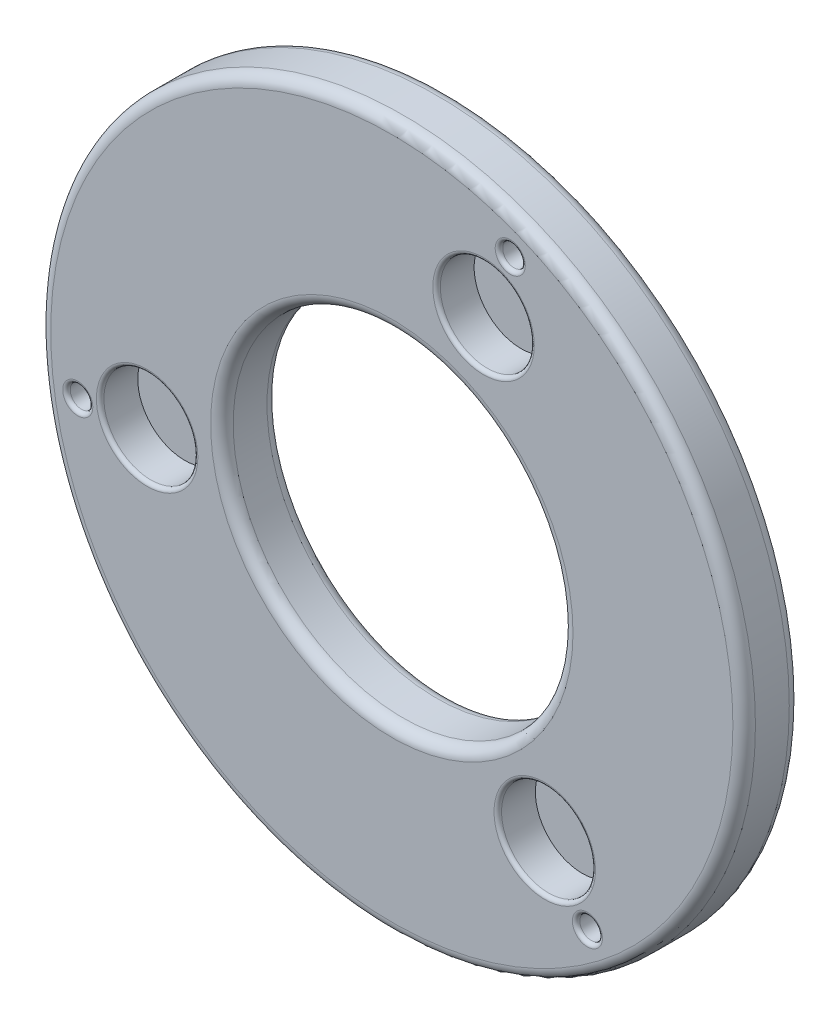
ISO-10303-21;
HEADER;
FILE_DESCRIPTION(('STEP AP214'),'2;1');
FILE_NAME('part.step','',(''),(''),'','','');
FILE_SCHEMA(('AUTOMOTIVE_DESIGN { 1 0 10303 214 1 1 1 1 }'));
ENDSEC;
DATA;
#1=APPLICATION_CONTEXT('core data for automotive mechanical design processes');
#2=APPLICATION_PROTOCOL_DEFINITION('international standard','automotive_design',2000,#1);
#3=PRODUCT_CONTEXT('',#1,'mechanical');
#4=PRODUCT('Part','Part','',(#3));
#5=PRODUCT_RELATED_PRODUCT_CATEGORY('part','',(#4));
#6=PRODUCT_DEFINITION_FORMATION('','',#4);
#7=PRODUCT_DEFINITION_CONTEXT('part definition',#1,'design');
#8=PRODUCT_DEFINITION('design','',#6,#7);
#9=PRODUCT_DEFINITION_SHAPE('','',#8);
#10=(LENGTH_UNIT() NAMED_UNIT(*) SI_UNIT(.MILLI.,.METRE.));
#11=(NAMED_UNIT(*) PLANE_ANGLE_UNIT() SI_UNIT($,.RADIAN.));
#12=(NAMED_UNIT(*) SI_UNIT($,.STERADIAN.) SOLID_ANGLE_UNIT());
#13=UNCERTAINTY_MEASURE_WITH_UNIT(LENGTH_MEASURE(1.E-05),#10,'distance_accuracy_value','');
#14=(GEOMETRIC_REPRESENTATION_CONTEXT(3) GLOBAL_UNCERTAINTY_ASSIGNED_CONTEXT((#13)) GLOBAL_UNIT_ASSIGNED_CONTEXT((#10,
#11,#12)) REPRESENTATION_CONTEXT('',''));
#15=CARTESIAN_POINT('',(0.,0.,0.));
#16=DIRECTION('',(0.,0.,1.));
#17=DIRECTION('',(1.,0.,0.));
#18=AXIS2_PLACEMENT_3D('',#15,#16,#17);
#19=CARTESIAN_POINT('',(0.,0.,30.));
#20=DIRECTION('',(0.,0.,-1.));
#21=DIRECTION('',(-1.,0.,0.));
#22=AXIS2_PLACEMENT_3D('',#19,#20,#21);
#23=CYLINDRICAL_SURFACE('',#22,187.5);
#24=CARTESIAN_POINT('',(0.,0.,6.));
#25=DIRECTION('',(0.,0.,1.));
#26=DIRECTION('',(1.,0.,0.));
#27=AXIS2_PLACEMENT_3D('',#24,#25,#26);
#28=CIRCLE('',#27,187.5);
#29=CARTESIAN_POINT('',(187.5,0.,6.));
#30=VERTEX_POINT('',#29);
#31=EDGE_CURVE('E63',#30,#30,#28,.T.);
#32=ORIENTED_EDGE('',*,*,#31,.T.);
#33=EDGE_LOOP('',(#32));
#34=FACE_BOUND('',#33,.T.);
#35=CARTESIAN_POINT('',(0.,0.,24.));
#36=DIRECTION('',(0.,0.,1.));
#37=DIRECTION('',(1.,0.,0.));
#38=AXIS2_PLACEMENT_3D('',#35,#36,#37);
#39=CIRCLE('',#38,187.5);
#40=CARTESIAN_POINT('',(187.5,0.,24.));
#41=VERTEX_POINT('',#40);
#42=EDGE_CURVE('E66',#41,#41,#39,.F.);
#43=ORIENTED_EDGE('',*,*,#42,.T.);
#44=EDGE_LOOP('',(#43));
#45=FACE_BOUND('',#44,.T.);
#46=ADVANCED_FACE('F37',(#34,#45),#23,.T.);
#47=CARTESIAN_POINT('',(0.,0.,30.));
#48=DIRECTION('',(0.,0.,1.));
#49=DIRECTION('',(1.,0.,0.));
#50=AXIS2_PLACEMENT_3D('',#47,#48,#49);
#51=PLANE('',#50);
#52=CARTESIAN_POINT('',(0.,0.,30.));
#53=DIRECTION('',(0.,0.,1.));
#54=DIRECTION('',(1.,0.,0.));
#55=AXIS2_PLACEMENT_3D('',#52,#53,#54);
#56=CIRCLE('',#55,96.4223656586048);
#57=CARTESIAN_POINT('',(96.4223656586048,0.,30.));
#58=VERTEX_POINT('',#57);
#59=EDGE_CURVE('E11',#58,#58,#56,.F.);
#60=ORIENTED_EDGE('',*,*,#59,.T.);
#61=EDGE_LOOP('',(#60));
#62=FACE_BOUND('',#61,.T.);
#63=CARTESIAN_POINT('',(0.,0.,30.));
#64=DIRECTION('',(0.,0.,1.));
#65=DIRECTION('',(1.,0.,0.));
#66=AXIS2_PLACEMENT_3D('',#63,#64,#65);
#67=CIRCLE('',#66,181.5);
#68=CARTESIAN_POINT('',(181.5,0.,30.));
#69=VERTEX_POINT('',#68);
#70=EDGE_CURVE('E57',#69,#69,#67,.T.);
#71=ORIENTED_EDGE('',*,*,#70,.T.);
#72=EDGE_LOOP('',(#71));
#73=FACE_BOUND('',#72,.T.);
#74=CARTESIAN_POINT('',(63.0228527870285,156.566120575123,30.));
#75=DIRECTION('',(0.,0.,1.));
#76=DIRECTION('',(1.,0.,0.));
#77=AXIS2_PLACEMENT_3D('',#74,#75,#76);
#78=CIRCLE('',#77,8.00000000000002);
#79=CARTESIAN_POINT('',(71.0228527870285,156.566120575123,30.));
#80=VERTEX_POINT('',#79);
#81=EDGE_CURVE('E69',#80,#80,#78,.F.);
#82=ORIENTED_EDGE('',*,*,#81,.T.);
#83=EDGE_LOOP('',(#82));
#84=FACE_BOUND('',#83,.T.);
#85=CARTESIAN_POINT('',(104.078811396519,-132.862451820095,30.));
#86=DIRECTION('',(0.,0.,1.));
#87=DIRECTION('',(1.,0.,0.));
#88=AXIS2_PLACEMENT_3D('',#85,#86,#87);
#89=CIRCLE('',#88,8.00000000000002);
#90=CARTESIAN_POINT('',(112.078811396519,-132.862451820095,30.));
#91=VERTEX_POINT('',#90);
#92=EDGE_CURVE('E72',#91,#91,#89,.F.);
#93=ORIENTED_EDGE('',*,*,#92,.T.);
#94=EDGE_LOOP('',(#93));
#95=FACE_BOUND('',#94,.T.);
#96=CARTESIAN_POINT('',(-167.101664183548,-23.7036687550278,30.));
#97=DIRECTION('',(0.,0.,1.));
#98=DIRECTION('',(1.,0.,0.));
#99=AXIS2_PLACEMENT_3D('',#96,#97,#98);
#100=CIRCLE('',#99,8.00000000000002);
#101=CARTESIAN_POINT('',(-159.101664183548,-23.7036687550278,30.));
#102=VERTEX_POINT('',#101);
#103=EDGE_CURVE('E75',#102,#102,#100,.F.);
#104=ORIENTED_EDGE('',*,*,#103,.T.);
#105=EDGE_LOOP('',(#104));
#106=FACE_BOUND('',#105,.T.);
#107=CARTESIAN_POINT('',(48.8104564622097,122.158080296552,30.));
#108=DIRECTION('',(0.,0.,1.));
#109=DIRECTION('',(1.,0.,0.));
#110=AXIS2_PLACEMENT_3D('',#107,#108,#109);
#111=CIRCLE('',#110,27.);
#112=CARTESIAN_POINT('',(75.8104564622097,122.158080296552,30.));
#113=VERTEX_POINT('',#112);
#114=EDGE_CURVE('E111',#113,#113,#111,.F.);
#115=ORIENTED_EDGE('',*,*,#114,.T.);
#116=EDGE_LOOP('',(#115));
#117=FACE_BOUND('',#116,.T.);
#118=CARTESIAN_POINT('',(81.3867725832482,-103.350135414864,30.));
#119=DIRECTION('',(0.,0.,1.));
#120=DIRECTION('',(1.,0.,0.));
#121=AXIS2_PLACEMENT_3D('',#118,#119,#120);
#122=CIRCLE('',#121,27.);
#123=CARTESIAN_POINT('',(108.386772583248,-103.350135414864,30.));
#124=VERTEX_POINT('',#123);
#125=EDGE_CURVE('E114',#124,#124,#122,.F.);
#126=ORIENTED_EDGE('',*,*,#125,.T.);
#127=EDGE_LOOP('',(#126));
#128=FACE_BOUND('',#127,.T.);
#129=CARTESIAN_POINT('',(-130.197229045458,-18.807944881688,30.));
#130=DIRECTION('',(0.,0.,1.));
#131=DIRECTION('',(1.,0.,0.));
#132=AXIS2_PLACEMENT_3D('',#129,#130,#131);
#133=CIRCLE('',#132,27.);
#134=CARTESIAN_POINT('',(-103.197229045458,-18.807944881688,30.));
#135=VERTEX_POINT('',#134);
#136=EDGE_CURVE('E117',#135,#135,#133,.F.);
#137=ORIENTED_EDGE('',*,*,#136,.T.);
#138=EDGE_LOOP('',(#137));
#139=FACE_BOUND('',#138,.T.);
#140=ADVANCED_FACE('F151',(#62,#73,#84,#95,#106,#117,#128,#139),#51,.T.);
#141=CARTESIAN_POINT('',(0.,0.,0.));
#142=DIRECTION('',(0.,0.,1.));
#143=DIRECTION('',(1.,0.,0.));
#144=AXIS2_PLACEMENT_3D('',#141,#142,#143);
#145=PLANE('',#144);
#146=CARTESIAN_POINT('',(0.,0.,0.));
#147=DIRECTION('',(0.,0.,1.));
#148=DIRECTION('',(1.,0.,0.));
#149=AXIS2_PLACEMENT_3D('',#146,#147,#148);
#150=CIRCLE('',#149,96.4223656586048);
#151=CARTESIAN_POINT('',(96.4223656586048,0.,0.));
#152=VERTEX_POINT('',#151);
#153=EDGE_CURVE('E44',#152,#152,#150,.T.);
#154=ORIENTED_EDGE('',*,*,#153,.T.);
#155=EDGE_LOOP('',(#154));
#156=FACE_BOUND('',#155,.T.);
#157=CARTESIAN_POINT('',(0.,0.,0.));
#158=DIRECTION('',(0.,0.,1.));
#159=DIRECTION('',(1.,0.,0.));
#160=AXIS2_PLACEMENT_3D('',#157,#158,#159);
#161=CIRCLE('',#160,181.5);
#162=CARTESIAN_POINT('',(181.5,0.,0.));
#163=VERTEX_POINT('',#162);
#164=EDGE_CURVE('E60',#163,#163,#161,.F.);
#165=ORIENTED_EDGE('',*,*,#164,.T.);
#166=EDGE_LOOP('',(#165));
#167=FACE_BOUND('',#166,.T.);
#168=CARTESIAN_POINT('',(-167.101664183548,-23.7036687550278,0.));
#169=DIRECTION('',(0.,0.,1.));
#170=DIRECTION('',(1.,0.,0.));
#171=AXIS2_PLACEMENT_3D('',#168,#169,#170);
#172=CIRCLE('',#171,8.00000000000002);
#173=CARTESIAN_POINT('',(-159.101664183548,-23.7036687550278,0.));
#174=VERTEX_POINT('',#173);
#175=EDGE_CURVE('E90',#174,#174,#172,.T.);
#176=ORIENTED_EDGE('',*,*,#175,.T.);
#177=EDGE_LOOP('',(#176));
#178=FACE_BOUND('',#177,.T.);
#179=CARTESIAN_POINT('',(63.0228527870285,156.566120575123,0.));
#180=DIRECTION('',(0.,0.,1.));
#181=DIRECTION('',(1.,0.,0.));
#182=AXIS2_PLACEMENT_3D('',#179,#180,#181);
#183=CIRCLE('',#182,8.00000000000002);
#184=CARTESIAN_POINT('',(71.0228527870285,156.566120575123,0.));
#185=VERTEX_POINT('',#184);
#186=EDGE_CURVE('E93',#185,#185,#183,.T.);
#187=ORIENTED_EDGE('',*,*,#186,.T.);
#188=EDGE_LOOP('',(#187));
#189=FACE_BOUND('',#188,.T.);
#190=CARTESIAN_POINT('',(104.078811396519,-132.862451820095,0.));
#191=DIRECTION('',(0.,0.,1.));
#192=DIRECTION('',(1.,0.,0.));
#193=AXIS2_PLACEMENT_3D('',#190,#191,#192);
#194=CIRCLE('',#193,8.00000000000002);
#195=CARTESIAN_POINT('',(112.078811396519,-132.862451820095,0.));
#196=VERTEX_POINT('',#195);
#197=EDGE_CURVE('E96',#196,#196,#194,.T.);
#198=ORIENTED_EDGE('',*,*,#197,.T.);
#199=EDGE_LOOP('',(#198));
#200=FACE_BOUND('',#199,.T.);
#201=ADVANCED_FACE('F157',(#156,#167,#178,#189,#200),#145,.F.);
#202=CARTESIAN_POINT('',(48.8104564622097,122.158080296552,10.));
#203=DIRECTION('',(0.,0.,1.));
#204=DIRECTION('',(1.,0.,0.));
#205=AXIS2_PLACEMENT_3D('',#202,#203,#204);
#206=CYLINDRICAL_SURFACE('',#205,25.);
#207=CARTESIAN_POINT('',(48.8104564622097,122.158080296552,28.));
#208=DIRECTION('',(0.,0.,1.));
#209=DIRECTION('',(1.,0.,0.));
#210=AXIS2_PLACEMENT_3D('',#207,#208,#209);
#211=CIRCLE('',#210,25.);
#212=CARTESIAN_POINT('',(73.8104564622097,122.158080296552,28.));
#213=VERTEX_POINT('',#212);
#214=EDGE_CURVE('E120',#213,#213,#211,.T.);
#215=ORIENTED_EDGE('',*,*,#214,.T.);
#216=EDGE_LOOP('',(#215));
#217=FACE_BOUND('',#216,.T.);
#218=CARTESIAN_POINT('',(48.8104564622097,122.158080296552,10.));
#219=DIRECTION('',(0.,0.,1.));
#220=DIRECTION('',(1.,0.,0.));
#221=AXIS2_PLACEMENT_3D('',#218,#219,#220);
#222=CIRCLE('',#221,25.);
#223=CARTESIAN_POINT('',(73.8104564622097,122.158080296552,10.));
#224=VERTEX_POINT('',#223);
#225=EDGE_CURVE('E124',#224,#224,#222,.T.);
#226=ORIENTED_EDGE('',*,*,#225,.F.);
#227=EDGE_LOOP('',(#226));
#228=FACE_BOUND('',#227,.T.);
#229=ADVANCED_FACE('F311',(#217,#228),#206,.F.);
#230=CARTESIAN_POINT('',(48.8104564622097,122.158080296552,10.));
#231=DIRECTION('',(0.,0.,1.));
#232=DIRECTION('',(1.,0.,0.));
#233=AXIS2_PLACEMENT_3D('',#230,#231,#232);
#234=PLANE('',#233);
#235=ORIENTED_EDGE('',*,*,#225,.T.);
#236=EDGE_LOOP('',(#235));
#237=FACE_BOUND('',#236,.T.);
#238=ADVANCED_FACE('F333',(#237),#234,.T.);
#239=CARTESIAN_POINT('',(-130.197229045458,-18.807944881688,10.));
#240=DIRECTION('',(0.,0.,1.));
#241=DIRECTION('',(1.,0.,0.));
#242=AXIS2_PLACEMENT_3D('',#239,#240,#241);
#243=CYLINDRICAL_SURFACE('',#242,25.);
#244=CARTESIAN_POINT('',(-130.197229045458,-18.807944881688,28.));
#245=DIRECTION('',(0.,0.,1.));
#246=DIRECTION('',(1.,0.,0.));
#247=AXIS2_PLACEMENT_3D('',#244,#245,#246);
#248=CIRCLE('',#247,25.);
#249=CARTESIAN_POINT('',(-105.197229045458,-18.807944881688,28.));
#250=VERTEX_POINT('',#249);
#251=EDGE_CURVE('E105',#250,#250,#248,.T.);
#252=ORIENTED_EDGE('',*,*,#251,.T.);
#253=EDGE_LOOP('',(#252));
#254=FACE_BOUND('',#253,.T.);
#255=CARTESIAN_POINT('',(-130.197229045458,-18.807944881688,10.));
#256=DIRECTION('',(0.,0.,1.));
#257=DIRECTION('',(1.,0.,0.));
#258=AXIS2_PLACEMENT_3D('',#255,#256,#257);
#259=CIRCLE('',#258,25.);
#260=CARTESIAN_POINT('',(-105.197229045458,-18.807944881688,10.));
#261=VERTEX_POINT('',#260);
#262=EDGE_CURVE('E127',#261,#261,#259,.T.);
#263=ORIENTED_EDGE('',*,*,#262,.F.);
#264=EDGE_LOOP('',(#263));
#265=FACE_BOUND('',#264,.T.);
#266=ADVANCED_FACE('F146',(#254,#265),#243,.F.);
#267=CARTESIAN_POINT('',(-130.197229045458,-18.807944881688,10.));
#268=DIRECTION('',(0.,0.,1.));
#269=DIRECTION('',(1.,0.,0.));
#270=AXIS2_PLACEMENT_3D('',#267,#268,#269);
#271=PLANE('',#270);
#272=ORIENTED_EDGE('',*,*,#262,.T.);
#273=EDGE_LOOP('',(#272));
#274=FACE_BOUND('',#273,.T.);
#275=ADVANCED_FACE('F137',(#274),#271,.T.);
#276=CARTESIAN_POINT('',(81.3867725832482,-103.350135414864,10.));
#277=DIRECTION('',(0.,0.,1.));
#278=DIRECTION('',(1.,0.,0.));
#279=AXIS2_PLACEMENT_3D('',#276,#277,#278);
#280=CYLINDRICAL_SURFACE('',#279,25.);
#281=CARTESIAN_POINT('',(81.3867725832482,-103.350135414864,28.));
#282=DIRECTION('',(0.,0.,1.));
#283=DIRECTION('',(1.,0.,0.));
#284=AXIS2_PLACEMENT_3D('',#281,#282,#283);
#285=CIRCLE('',#284,25.);
#286=CARTESIAN_POINT('',(106.386772583248,-103.350135414864,28.));
#287=VERTEX_POINT('',#286);
#288=EDGE_CURVE('E108',#287,#287,#285,.T.);
#289=ORIENTED_EDGE('',*,*,#288,.T.);
#290=EDGE_LOOP('',(#289));
#291=FACE_BOUND('',#290,.T.);
#292=CARTESIAN_POINT('',(81.3867725832482,-103.350135414864,10.));
#293=DIRECTION('',(0.,0.,1.));
#294=DIRECTION('',(1.,0.,0.));
#295=AXIS2_PLACEMENT_3D('',#292,#293,#294);
#296=CIRCLE('',#295,25.);
#297=CARTESIAN_POINT('',(106.386772583248,-103.350135414864,10.));
#298=VERTEX_POINT('',#297);
#299=EDGE_CURVE('E123',#298,#298,#296,.T.);
#300=ORIENTED_EDGE('',*,*,#299,.F.);
#301=EDGE_LOOP('',(#300));
#302=FACE_BOUND('',#301,.T.);
#303=ADVANCED_FACE('F135',(#291,#302),#280,.F.);
#304=CARTESIAN_POINT('',(81.3867725832482,-103.350135414864,10.));
#305=DIRECTION('',(0.,0.,1.));
#306=DIRECTION('',(1.,0.,0.));
#307=AXIS2_PLACEMENT_3D('',#304,#305,#306);
#308=PLANE('',#307);
#309=ORIENTED_EDGE('',*,*,#299,.T.);
#310=EDGE_LOOP('',(#309));
#311=FACE_BOUND('',#310,.T.);
#312=ADVANCED_FACE('F133',(#311),#308,.T.);
#313=CARTESIAN_POINT('',(63.0228527870285,156.566120575123,-16.9705627484772));
#314=DIRECTION('',(0.,0.,1.));
#315=DIRECTION('',(1.,0.,0.));
#316=AXIS2_PLACEMENT_3D('',#313,#314,#315);
#317=CYLINDRICAL_SURFACE('',#316,6.00000000000002);
#318=CARTESIAN_POINT('',(63.0228527870285,156.566120575123,2.));
#319=DIRECTION('',(0.,0.,1.));
#320=DIRECTION('',(1.,0.,0.));
#321=AXIS2_PLACEMENT_3D('',#318,#319,#320);
#322=CIRCLE('',#321,6.00000000000002);
#323=CARTESIAN_POINT('',(69.0228527870285,156.566120575123,2.));
#324=VERTEX_POINT('',#323);
#325=EDGE_CURVE('E84',#324,#324,#322,.F.);
#326=ORIENTED_EDGE('',*,*,#325,.T.);
#327=EDGE_LOOP('',(#326));
#328=FACE_BOUND('',#327,.T.);
#329=CARTESIAN_POINT('',(63.0228527870285,156.566120575123,28.));
#330=DIRECTION('',(0.,0.,1.));
#331=DIRECTION('',(1.,0.,0.));
#332=AXIS2_PLACEMENT_3D('',#329,#330,#331);
#333=CIRCLE('',#332,6.00000000000002);
#334=CARTESIAN_POINT('',(69.0228527870285,156.566120575123,28.));
#335=VERTEX_POINT('',#334);
#336=EDGE_CURVE('E87',#335,#335,#333,.T.);
#337=ORIENTED_EDGE('',*,*,#336,.T.);
#338=EDGE_LOOP('',(#337));
#339=FACE_BOUND('',#338,.T.);
#340=ADVANCED_FACE('F144',(#328,#339),#317,.F.);
#341=CARTESIAN_POINT('',(-167.101664183548,-23.7036687550278,-16.9705627484772));
#342=DIRECTION('',(0.,0.,1.));
#343=DIRECTION('',(1.,0.,0.));
#344=AXIS2_PLACEMENT_3D('',#341,#342,#343);
#345=CYLINDRICAL_SURFACE('',#344,6.00000000000002);
#346=CARTESIAN_POINT('',(-167.101664183548,-23.7036687550278,2.));
#347=DIRECTION('',(0.,0.,1.));
#348=DIRECTION('',(1.,0.,0.));
#349=AXIS2_PLACEMENT_3D('',#346,#347,#348);
#350=CIRCLE('',#349,6.00000000000002);
#351=CARTESIAN_POINT('',(-161.101664183548,-23.7036687550278,2.));
#352=VERTEX_POINT('',#351);
#353=EDGE_CURVE('E99',#352,#352,#350,.F.);
#354=ORIENTED_EDGE('',*,*,#353,.T.);
#355=EDGE_LOOP('',(#354));
#356=FACE_BOUND('',#355,.T.);
#357=CARTESIAN_POINT('',(-167.101664183548,-23.7036687550278,28.));
#358=DIRECTION('',(0.,0.,1.));
#359=DIRECTION('',(1.,0.,0.));
#360=AXIS2_PLACEMENT_3D('',#357,#358,#359);
#361=CIRCLE('',#360,6.00000000000002);
#362=CARTESIAN_POINT('',(-161.101664183548,-23.7036687550278,28.));
#363=VERTEX_POINT('',#362);
#364=EDGE_CURVE('E102',#363,#363,#361,.T.);
#365=ORIENTED_EDGE('',*,*,#364,.T.);
#366=EDGE_LOOP('',(#365));
#367=FACE_BOUND('',#366,.T.);
#368=ADVANCED_FACE('F227',(#356,#367),#345,.F.);
#369=CARTESIAN_POINT('',(104.078811396519,-132.862451820095,-16.9705627484772));
#370=DIRECTION('',(0.,0.,1.));
#371=DIRECTION('',(1.,0.,0.));
#372=AXIS2_PLACEMENT_3D('',#369,#370,#371);
#373=CYLINDRICAL_SURFACE('',#372,6.00000000000002);
#374=CARTESIAN_POINT('',(104.078811396519,-132.862451820095,2.));
#375=DIRECTION('',(0.,0.,1.));
#376=DIRECTION('',(1.,0.,0.));
#377=AXIS2_PLACEMENT_3D('',#374,#375,#376);
#378=CIRCLE('',#377,6.00000000000002);
#379=CARTESIAN_POINT('',(110.078811396519,-132.862451820095,2.));
#380=VERTEX_POINT('',#379);
#381=EDGE_CURVE('E78',#380,#380,#378,.F.);
#382=ORIENTED_EDGE('',*,*,#381,.T.);
#383=EDGE_LOOP('',(#382));
#384=FACE_BOUND('',#383,.T.);
#385=CARTESIAN_POINT('',(104.078811396519,-132.862451820095,28.));
#386=DIRECTION('',(0.,0.,1.));
#387=DIRECTION('',(1.,0.,0.));
#388=AXIS2_PLACEMENT_3D('',#385,#386,#387);
#389=CIRCLE('',#388,6.00000000000002);
#390=CARTESIAN_POINT('',(110.078811396519,-132.862451820095,28.));
#391=VERTEX_POINT('',#390);
#392=EDGE_CURVE('E81',#391,#391,#389,.T.);
#393=ORIENTED_EDGE('',*,*,#392,.T.);
#394=EDGE_LOOP('',(#393));
#395=FACE_BOUND('',#394,.T.);
#396=ADVANCED_FACE('F166',(#384,#395),#373,.F.);
#397=CARTESIAN_POINT('',(48.8104564622097,122.158080296552,28.));
#398=DIRECTION('',(0.,0.,1.));
#399=DIRECTION('',(1.,0.,0.));
#400=AXIS2_PLACEMENT_3D('',#397,#398,#399);
#401=TOROIDAL_SURFACE('',#400,27.,2.);
#402=ORIENTED_EDGE('',*,*,#114,.F.);
#403=EDGE_LOOP('',(#402));
#404=FACE_BOUND('',#403,.T.);
#405=ORIENTED_EDGE('',*,*,#214,.F.);
#406=EDGE_LOOP('',(#405));
#407=FACE_BOUND('',#406,.T.);
#408=ADVANCED_FACE('F162',(#404,#407),#401,.T.);
#409=CARTESIAN_POINT('',(81.3867725832482,-103.350135414864,28.));
#410=DIRECTION('',(0.,0.,1.));
#411=DIRECTION('',(1.,0.,0.));
#412=AXIS2_PLACEMENT_3D('',#409,#410,#411);
#413=TOROIDAL_SURFACE('',#412,27.,2.);
#414=ORIENTED_EDGE('',*,*,#125,.F.);
#415=EDGE_LOOP('',(#414));
#416=FACE_BOUND('',#415,.T.);
#417=ORIENTED_EDGE('',*,*,#288,.F.);
#418=EDGE_LOOP('',(#417));
#419=FACE_BOUND('',#418,.T.);
#420=ADVANCED_FACE('F165',(#416,#419),#413,.T.);
#421=CARTESIAN_POINT('',(-130.197229045458,-18.807944881688,28.));
#422=DIRECTION('',(0.,0.,1.));
#423=DIRECTION('',(1.,0.,0.));
#424=AXIS2_PLACEMENT_3D('',#421,#422,#423);
#425=TOROIDAL_SURFACE('',#424,27.,2.);
#426=ORIENTED_EDGE('',*,*,#136,.F.);
#427=EDGE_LOOP('',(#426));
#428=FACE_BOUND('',#427,.T.);
#429=ORIENTED_EDGE('',*,*,#251,.F.);
#430=EDGE_LOOP('',(#429));
#431=FACE_BOUND('',#430,.T.);
#432=ADVANCED_FACE('F170',(#428,#431),#425,.T.);
#433=CARTESIAN_POINT('',(-167.101664183548,-23.7036687550278,2.));
#434=DIRECTION('',(0.,0.,1.));
#435=DIRECTION('',(1.,0.,0.));
#436=AXIS2_PLACEMENT_3D('',#433,#434,#435);
#437=TOROIDAL_SURFACE('',#436,8.00000000000002,2.);
#438=ORIENTED_EDGE('',*,*,#175,.F.);
#439=EDGE_LOOP('',(#438));
#440=FACE_BOUND('',#439,.T.);
#441=ORIENTED_EDGE('',*,*,#353,.F.);
#442=EDGE_LOOP('',(#441));
#443=FACE_BOUND('',#442,.T.);
#444=ADVANCED_FACE('F174',(#440,#443),#437,.T.);
#445=CARTESIAN_POINT('',(63.0228527870285,156.566120575123,2.));
#446=DIRECTION('',(0.,0.,1.));
#447=DIRECTION('',(1.,0.,0.));
#448=AXIS2_PLACEMENT_3D('',#445,#446,#447);
#449=TOROIDAL_SURFACE('',#448,8.00000000000002,2.);
#450=ORIENTED_EDGE('',*,*,#186,.F.);
#451=EDGE_LOOP('',(#450));
#452=FACE_BOUND('',#451,.T.);
#453=ORIENTED_EDGE('',*,*,#325,.F.);
#454=EDGE_LOOP('',(#453));
#455=FACE_BOUND('',#454,.T.);
#456=ADVANCED_FACE('F178',(#452,#455),#449,.T.);
#457=CARTESIAN_POINT('',(104.078811396519,-132.862451820095,2.));
#458=DIRECTION('',(0.,0.,1.));
#459=DIRECTION('',(1.,0.,0.));
#460=AXIS2_PLACEMENT_3D('',#457,#458,#459);
#461=TOROIDAL_SURFACE('',#460,8.00000000000002,2.);
#462=ORIENTED_EDGE('',*,*,#197,.F.);
#463=EDGE_LOOP('',(#462));
#464=FACE_BOUND('',#463,.T.);
#465=ORIENTED_EDGE('',*,*,#381,.F.);
#466=EDGE_LOOP('',(#465));
#467=FACE_BOUND('',#466,.T.);
#468=ADVANCED_FACE('F182',(#464,#467),#461,.T.);
#469=CARTESIAN_POINT('',(63.0228527870285,156.566120575123,28.));
#470=DIRECTION('',(0.,0.,1.));
#471=DIRECTION('',(1.,0.,0.));
#472=AXIS2_PLACEMENT_3D('',#469,#470,#471);
#473=TOROIDAL_SURFACE('',#472,8.00000000000002,2.);
#474=ORIENTED_EDGE('',*,*,#81,.F.);
#475=EDGE_LOOP('',(#474));
#476=FACE_BOUND('',#475,.T.);
#477=ORIENTED_EDGE('',*,*,#336,.F.);
#478=EDGE_LOOP('',(#477));
#479=FACE_BOUND('',#478,.T.);
#480=ADVANCED_FACE('F186',(#476,#479),#473,.T.);
#481=CARTESIAN_POINT('',(104.078811396519,-132.862451820095,28.));
#482=DIRECTION('',(0.,0.,1.));
#483=DIRECTION('',(1.,0.,0.));
#484=AXIS2_PLACEMENT_3D('',#481,#482,#483);
#485=TOROIDAL_SURFACE('',#484,8.00000000000002,2.);
#486=ORIENTED_EDGE('',*,*,#92,.F.);
#487=EDGE_LOOP('',(#486));
#488=FACE_BOUND('',#487,.T.);
#489=ORIENTED_EDGE('',*,*,#392,.F.);
#490=EDGE_LOOP('',(#489));
#491=FACE_BOUND('',#490,.T.);
#492=ADVANCED_FACE('F190',(#488,#491),#485,.T.);
#493=CARTESIAN_POINT('',(-167.101664183548,-23.7036687550278,28.));
#494=DIRECTION('',(0.,0.,1.));
#495=DIRECTION('',(1.,0.,0.));
#496=AXIS2_PLACEMENT_3D('',#493,#494,#495);
#497=TOROIDAL_SURFACE('',#496,8.00000000000002,2.);
#498=ORIENTED_EDGE('',*,*,#103,.F.);
#499=EDGE_LOOP('',(#498));
#500=FACE_BOUND('',#499,.T.);
#501=ORIENTED_EDGE('',*,*,#364,.F.);
#502=EDGE_LOOP('',(#501));
#503=FACE_BOUND('',#502,.T.);
#504=ADVANCED_FACE('F194',(#500,#503),#497,.T.);
#505=CARTESIAN_POINT('',(0.,0.,6.));
#506=DIRECTION('',(0.,0.,1.));
#507=DIRECTION('',(1.,0.,0.));
#508=AXIS2_PLACEMENT_3D('',#505,#506,#507);
#509=TOROIDAL_SURFACE('',#508,181.5,6.);
#510=ORIENTED_EDGE('',*,*,#164,.F.);
#511=EDGE_LOOP('',(#510));
#512=FACE_BOUND('',#511,.T.);
#513=ORIENTED_EDGE('',*,*,#31,.F.);
#514=EDGE_LOOP('',(#513));
#515=FACE_BOUND('',#514,.T.);
#516=ADVANCED_FACE('F198',(#512,#515),#509,.T.);
#517=CARTESIAN_POINT('',(0.,0.,24.));
#518=DIRECTION('',(0.,0.,1.));
#519=DIRECTION('',(1.,0.,0.));
#520=AXIS2_PLACEMENT_3D('',#517,#518,#519);
#521=TOROIDAL_SURFACE('',#520,181.5,6.);
#522=ORIENTED_EDGE('',*,*,#42,.F.);
#523=EDGE_LOOP('',(#522));
#524=FACE_BOUND('',#523,.T.);
#525=ORIENTED_EDGE('',*,*,#70,.F.);
#526=EDGE_LOOP('',(#525));
#527=FACE_BOUND('',#526,.T.);
#528=ADVANCED_FACE('F202',(#524,#527),#521,.T.);
#529=CARTESIAN_POINT('',(0.,0.,-255.753071712516));
#530=DIRECTION('',(0.,0.,1.));
#531=DIRECTION('',(1.,0.,0.));
#532=AXIS2_PLACEMENT_3D('',#529,#530,#531);
#533=CYLINDRICAL_SURFACE('',#532,90.4223656586048);
#534=CARTESIAN_POINT('',(0.,0.,6.00000000000001));
#535=DIRECTION('',(0.,0.,1.));
#536=DIRECTION('',(1.,0.,0.));
#537=AXIS2_PLACEMENT_3D('',#534,#535,#536);
#538=CIRCLE('',#537,90.4223656586048);
#539=CARTESIAN_POINT('',(90.4223656586048,0.,6.00000000000001));
#540=VERTEX_POINT('',#539);
#541=EDGE_CURVE('E48',#540,#540,#538,.F.);
#542=ORIENTED_EDGE('',*,*,#541,.T.);
#543=EDGE_LOOP('',(#542));
#544=FACE_BOUND('',#543,.T.);
#545=CARTESIAN_POINT('',(0.,0.,24.));
#546=DIRECTION('',(0.,0.,1.));
#547=DIRECTION('',(1.,0.,0.));
#548=AXIS2_PLACEMENT_3D('',#545,#546,#547);
#549=CIRCLE('',#548,90.4223656586048);
#550=CARTESIAN_POINT('',(90.4223656586048,0.,24.));
#551=VERTEX_POINT('',#550);
#552=EDGE_CURVE('E52',#551,#551,#549,.T.);
#553=ORIENTED_EDGE('',*,*,#552,.T.);
#554=EDGE_LOOP('',(#553));
#555=FACE_BOUND('',#554,.T.);
#556=ADVANCED_FACE('F205',(#544,#555),#533,.F.);
#557=CARTESIAN_POINT('',(0.,0.,6.00000000000001));
#558=DIRECTION('',(0.,0.,1.));
#559=DIRECTION('',(1.,0.,0.));
#560=AXIS2_PLACEMENT_3D('',#557,#558,#559);
#561=TOROIDAL_SURFACE('',#560,96.4223656586048,6.);
#562=ORIENTED_EDGE('',*,*,#153,.F.);
#563=EDGE_LOOP('',(#562));
#564=FACE_BOUND('',#563,.T.);
#565=ORIENTED_EDGE('',*,*,#541,.F.);
#566=EDGE_LOOP('',(#565));
#567=FACE_BOUND('',#566,.T.);
#568=ADVANCED_FACE('F207',(#564,#567),#561,.T.);
#569=CARTESIAN_POINT('',(0.,0.,24.));
#570=DIRECTION('',(0.,0.,1.));
#571=DIRECTION('',(1.,0.,0.));
#572=AXIS2_PLACEMENT_3D('',#569,#570,#571);
#573=TOROIDAL_SURFACE('',#572,96.4223656586048,6.);
#574=ORIENTED_EDGE('',*,*,#59,.F.);
#575=EDGE_LOOP('',(#574));
#576=FACE_BOUND('',#575,.T.);
#577=ORIENTED_EDGE('',*,*,#552,.F.);
#578=EDGE_LOOP('',(#577));
#579=FACE_BOUND('',#578,.T.);
#580=ADVANCED_FACE('F39',(#576,#579),#573,.T.);
#581=CLOSED_SHELL('',(#46,#140,#201,#229,#238,#266,#275,#303,#312,#340,#368,#396,#408,#420,#432,
#444,#456,#468,#480,#492,#504,#516,#528,#556,#568,#580));
#582=MANIFOLD_SOLID_BREP('B2',#581);
#583=ADVANCED_BREP_SHAPE_REPRESENTATION('',(#18,#582),#14);
#584=SHAPE_DEFINITION_REPRESENTATION(#9,#583);
ENDSEC;
END-ISO-10303-21;
